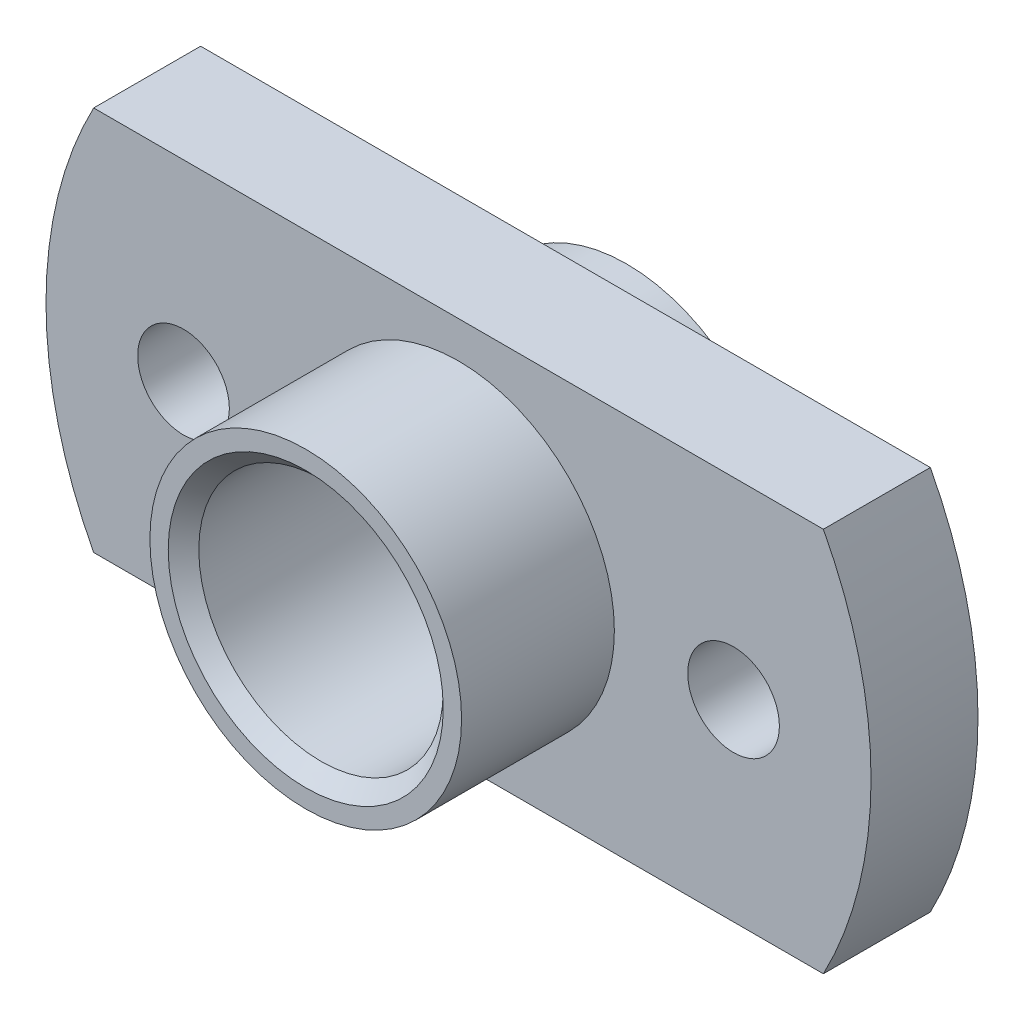
ISO-10303-21;
HEADER;
FILE_DESCRIPTION(('STEP AP214'),'2;1');
FILE_NAME('part.step','',(''),(''),'','','');
FILE_SCHEMA(('AUTOMOTIVE_DESIGN { 1 0 10303 214 1 1 1 1 }'));
ENDSEC;
DATA;
#1=APPLICATION_CONTEXT('core data for automotive mechanical design processes');
#2=APPLICATION_PROTOCOL_DEFINITION('international standard','automotive_design',2000,#1);
#3=PRODUCT_CONTEXT('',#1,'mechanical');
#4=PRODUCT('Part','Part','',(#3));
#5=PRODUCT_RELATED_PRODUCT_CATEGORY('part','',(#4));
#6=PRODUCT_DEFINITION_FORMATION('','',#4);
#7=PRODUCT_DEFINITION_CONTEXT('part definition',#1,'design');
#8=PRODUCT_DEFINITION('design','',#6,#7);
#9=PRODUCT_DEFINITION_SHAPE('','',#8);
#10=(LENGTH_UNIT() NAMED_UNIT(*) SI_UNIT(.MILLI.,.METRE.));
#11=(NAMED_UNIT(*) PLANE_ANGLE_UNIT() SI_UNIT($,.RADIAN.));
#12=(NAMED_UNIT(*) SI_UNIT($,.STERADIAN.) SOLID_ANGLE_UNIT());
#13=UNCERTAINTY_MEASURE_WITH_UNIT(LENGTH_MEASURE(1.E-05),#10,'distance_accuracy_value','');
#14=(GEOMETRIC_REPRESENTATION_CONTEXT(3) GLOBAL_UNCERTAINTY_ASSIGNED_CONTEXT((#13)) GLOBAL_UNIT_ASSIGNED_CONTEXT((#10,
#11,#12)) REPRESENTATION_CONTEXT('',''));
#15=CARTESIAN_POINT('',(0.,0.,0.));
#16=DIRECTION('',(0.,0.,1.));
#17=DIRECTION('',(1.,0.,0.));
#18=AXIS2_PLACEMENT_3D('',#15,#16,#17);
#19=CARTESIAN_POINT('',(0.,0.,3.5));
#20=DIRECTION('',(0.,0.,1.));
#21=DIRECTION('',(1.,0.,0.));
#22=AXIS2_PLACEMENT_3D('',#19,#20,#21);
#23=PLANE('',#22);
#24=CARTESIAN_POINT('',(0.,0.,3.5));
#25=DIRECTION('',(0.,0.,1.));
#26=DIRECTION('',(1.,0.,0.));
#27=AXIS2_PLACEMENT_3D('',#24,#25,#26);
#28=CIRCLE('',#27,5.1);
#29=CARTESIAN_POINT('',(5.1,0.,3.5));
#30=VERTEX_POINT('',#29);
#31=EDGE_CURVE('E118',#30,#30,#28,.T.);
#32=ORIENTED_EDGE('',*,*,#31,.F.);
#33=EDGE_LOOP('',(#32));
#34=FACE_BOUND('',#33,.T.);
#35=CARTESIAN_POINT('',(-9.,0.,3.5));
#36=DIRECTION('',(0.,0.,1.));
#37=DIRECTION('',(1.,0.,0.));
#38=AXIS2_PLACEMENT_3D('',#35,#36,#37);
#39=CIRCLE('',#38,1.5);
#40=CARTESIAN_POINT('',(-7.5,0.,3.5));
#41=VERTEX_POINT('',#40);
#42=EDGE_CURVE('E111',#41,#41,#39,.T.);
#43=ORIENTED_EDGE('',*,*,#42,.F.);
#44=EDGE_LOOP('',(#43));
#45=FACE_BOUND('',#44,.T.);
#46=CARTESIAN_POINT('',(0.,0.,3.5));
#47=DIRECTION('',(0.,0.,1.));
#48=DIRECTION('',(1.,0.,0.));
#49=AXIS2_PLACEMENT_3D('',#46,#47,#48);
#50=CIRCLE('',#49,13.5);
#51=CARTESIAN_POINT('',(-11.9398492452794,6.3,3.5));
#52=VERTEX_POINT('',#51);
#53=CARTESIAN_POINT('',(-11.9398492452794,-6.3,3.5));
#54=VERTEX_POINT('',#53);
#55=EDGE_CURVE('E93',#52,#54,#50,.T.);
#56=ORIENTED_EDGE('',*,*,#55,.T.);
#57=DIRECTION('',(1.,0.,0.));
#58=VECTOR('',#57,1.);
#59=CARTESIAN_POINT('',(-11.9398492452794,-6.3,3.5));
#60=LINE('',#59,#58);
#61=CARTESIAN_POINT('',(11.9398492452794,-6.3,3.5));
#62=VERTEX_POINT('',#61);
#63=EDGE_CURVE('E88',#54,#62,#60,.T.);
#64=ORIENTED_EDGE('',*,*,#63,.T.);
#65=CARTESIAN_POINT('',(0.,0.,3.5));
#66=DIRECTION('',(0.,0.,1.));
#67=DIRECTION('',(1.,0.,0.));
#68=AXIS2_PLACEMENT_3D('',#65,#66,#67);
#69=CIRCLE('',#68,13.5);
#70=CARTESIAN_POINT('',(11.9398492452794,6.3,3.5));
#71=VERTEX_POINT('',#70);
#72=EDGE_CURVE('E91',#62,#71,#69,.T.);
#73=ORIENTED_EDGE('',*,*,#72,.T.);
#74=DIRECTION('',(-1.,0.,0.));
#75=VECTOR('',#74,1.);
#76=CARTESIAN_POINT('',(-11.9398492452794,6.3,3.5));
#77=LINE('',#76,#75);
#78=EDGE_CURVE('E57',#71,#52,#77,.T.);
#79=ORIENTED_EDGE('',*,*,#78,.T.);
#80=EDGE_LOOP('',(#56,#64,#73,#79));
#81=FACE_BOUND('',#80,.T.);
#82=CARTESIAN_POINT('',(9.,0.,3.5));
#83=DIRECTION('',(0.,0.,1.));
#84=DIRECTION('',(1.,0.,0.));
#85=AXIS2_PLACEMENT_3D('',#82,#83,#84);
#86=CIRCLE('',#85,1.5);
#87=CARTESIAN_POINT('',(10.5,0.,3.5));
#88=VERTEX_POINT('',#87);
#89=EDGE_CURVE('E194',#88,#88,#86,.T.);
#90=ORIENTED_EDGE('',*,*,#89,.F.);
#91=EDGE_LOOP('',(#90));
#92=FACE_BOUND('',#91,.T.);
#93=ADVANCED_FACE('F39',(#34,#45,#81,#92),#23,.T.);
#94=CARTESIAN_POINT('',(0.,0.,0.));
#95=DIRECTION('',(0.,0.,1.));
#96=DIRECTION('',(1.,0.,0.));
#97=AXIS2_PLACEMENT_3D('',#94,#95,#96);
#98=PLANE('',#97);
#99=CARTESIAN_POINT('',(0.,0.,0.));
#100=DIRECTION('',(0.,0.,1.));
#101=DIRECTION('',(1.,0.,0.));
#102=AXIS2_PLACEMENT_3D('',#99,#100,#101);
#103=CIRCLE('',#102,5.1);
#104=CARTESIAN_POINT('',(5.1,0.,0.));
#105=VERTEX_POINT('',#104);
#106=EDGE_CURVE('E119',#105,#105,#103,.T.);
#107=ORIENTED_EDGE('',*,*,#106,.T.);
#108=EDGE_LOOP('',(#107));
#109=FACE_BOUND('',#108,.T.);
#110=CARTESIAN_POINT('',(0.,0.,0.));
#111=DIRECTION('',(0.,0.,1.));
#112=DIRECTION('',(1.,0.,0.));
#113=AXIS2_PLACEMENT_3D('',#110,#111,#112);
#114=CIRCLE('',#113,13.5);
#115=CARTESIAN_POINT('',(-11.9398492452794,6.3,0.));
#116=VERTEX_POINT('',#115);
#117=CARTESIAN_POINT('',(-11.9398492452794,-6.3,0.));
#118=VERTEX_POINT('',#117);
#119=EDGE_CURVE('E108',#116,#118,#114,.T.);
#120=ORIENTED_EDGE('',*,*,#119,.F.);
#121=DIRECTION('',(-1.,0.,0.));
#122=VECTOR('',#121,1.);
#123=CARTESIAN_POINT('',(-11.9398492452794,6.3,0.));
#124=LINE('',#123,#122);
#125=CARTESIAN_POINT('',(11.9398492452794,6.3,0.));
#126=VERTEX_POINT('',#125);
#127=EDGE_CURVE('E80',#126,#116,#124,.T.);
#128=ORIENTED_EDGE('',*,*,#127,.F.);
#129=CARTESIAN_POINT('',(0.,0.,0.));
#130=DIRECTION('',(0.,0.,1.));
#131=DIRECTION('',(1.,0.,0.));
#132=AXIS2_PLACEMENT_3D('',#129,#130,#131);
#133=CIRCLE('',#132,13.5);
#134=CARTESIAN_POINT('',(11.9398492452794,-6.3,0.));
#135=VERTEX_POINT('',#134);
#136=EDGE_CURVE('E74',#135,#126,#133,.T.);
#137=ORIENTED_EDGE('',*,*,#136,.F.);
#138=DIRECTION('',(1.,0.,0.));
#139=VECTOR('',#138,1.);
#140=CARTESIAN_POINT('',(-11.9398492452794,-6.3,0.));
#141=LINE('',#140,#139);
#142=EDGE_CURVE('E98',#118,#135,#141,.T.);
#143=ORIENTED_EDGE('',*,*,#142,.F.);
#144=EDGE_LOOP('',(#120,#128,#137,#143));
#145=FACE_BOUND('',#144,.T.);
#146=CARTESIAN_POINT('',(-9.,0.,0.));
#147=DIRECTION('',(0.,0.,1.));
#148=DIRECTION('',(1.,0.,0.));
#149=AXIS2_PLACEMENT_3D('',#146,#147,#148);
#150=CIRCLE('',#149,1.5);
#151=CARTESIAN_POINT('',(-7.5,0.,0.));
#152=VERTEX_POINT('',#151);
#153=EDGE_CURVE('E190',#152,#152,#150,.T.);
#154=ORIENTED_EDGE('',*,*,#153,.T.);
#155=EDGE_LOOP('',(#154));
#156=FACE_BOUND('',#155,.T.);
#157=CARTESIAN_POINT('',(9.,0.,0.));
#158=DIRECTION('',(0.,0.,1.));
#159=DIRECTION('',(1.,0.,0.));
#160=AXIS2_PLACEMENT_3D('',#157,#158,#159);
#161=CIRCLE('',#160,1.5);
#162=CARTESIAN_POINT('',(10.5,0.,0.));
#163=VERTEX_POINT('',#162);
#164=EDGE_CURVE('E122',#163,#163,#161,.T.);
#165=ORIENTED_EDGE('',*,*,#164,.T.);
#166=EDGE_LOOP('',(#165));
#167=FACE_BOUND('',#166,.T.);
#168=ADVANCED_FACE('F153',(#109,#145,#156,#167),#98,.F.);
#169=CARTESIAN_POINT('',(0.,0.,3.5));
#170=DIRECTION('',(0.,0.,-1.));
#171=DIRECTION('',(-1.,0.,0.));
#172=AXIS2_PLACEMENT_3D('',#169,#170,#171);
#173=CYLINDRICAL_SURFACE('',#172,13.5);
#174=ORIENTED_EDGE('',*,*,#119,.T.);
#175=DIRECTION('',(0.,0.,-1.));
#176=VECTOR('',#175,1.);
#177=CARTESIAN_POINT('',(-11.9398492452794,-6.3,3.5));
#178=LINE('',#177,#176);
#179=EDGE_CURVE('E99',#54,#118,#178,.T.);
#180=ORIENTED_EDGE('',*,*,#179,.F.);
#181=ORIENTED_EDGE('',*,*,#55,.F.);
#182=DIRECTION('',(0.,0.,-1.));
#183=VECTOR('',#182,1.);
#184=CARTESIAN_POINT('',(-11.9398492452794,6.3,3.5));
#185=LINE('',#184,#183);
#186=EDGE_CURVE('E104',#52,#116,#185,.T.);
#187=ORIENTED_EDGE('',*,*,#186,.T.);
#188=EDGE_LOOP('',(#174,#180,#181,#187));
#189=FACE_BOUND('',#188,.T.);
#190=ADVANCED_FACE('F159',(#189),#173,.T.);
#191=CARTESIAN_POINT('',(-11.9398492452794,-6.3,3.5));
#192=DIRECTION('',(0.,1.,0.));
#193=DIRECTION('',(0.,0.,1.));
#194=AXIS2_PLACEMENT_3D('',#191,#192,#193);
#195=PLANE('',#194);
#196=ORIENTED_EDGE('',*,*,#142,.T.);
#197=DIRECTION('',(0.,0.,-1.));
#198=VECTOR('',#197,1.);
#199=CARTESIAN_POINT('',(11.9398492452794,-6.3,3.5));
#200=LINE('',#199,#198);
#201=EDGE_CURVE('E96',#62,#135,#200,.T.);
#202=ORIENTED_EDGE('',*,*,#201,.F.);
#203=ORIENTED_EDGE('',*,*,#63,.F.);
#204=ORIENTED_EDGE('',*,*,#179,.T.);
#205=EDGE_LOOP('',(#196,#202,#203,#204));
#206=FACE_BOUND('',#205,.T.);
#207=ADVANCED_FACE('F97',(#206),#195,.F.);
#208=CARTESIAN_POINT('',(0.,0.,3.5));
#209=DIRECTION('',(0.,0.,-1.));
#210=DIRECTION('',(-1.,0.,0.));
#211=AXIS2_PLACEMENT_3D('',#208,#209,#210);
#212=CYLINDRICAL_SURFACE('',#211,13.5);
#213=ORIENTED_EDGE('',*,*,#136,.T.);
#214=DIRECTION('',(0.,0.,-1.));
#215=VECTOR('',#214,1.);
#216=CARTESIAN_POINT('',(11.9398492452794,6.3,3.5));
#217=LINE('',#216,#215);
#218=EDGE_CURVE('E100',#71,#126,#217,.T.);
#219=ORIENTED_EDGE('',*,*,#218,.F.);
#220=ORIENTED_EDGE('',*,*,#72,.F.);
#221=ORIENTED_EDGE('',*,*,#201,.T.);
#222=EDGE_LOOP('',(#213,#219,#220,#221));
#223=FACE_BOUND('',#222,.T.);
#224=ADVANCED_FACE('F102',(#223),#212,.T.);
#225=CARTESIAN_POINT('',(-11.9398492452794,6.3,3.5));
#226=DIRECTION('',(0.,-1.,0.));
#227=DIRECTION('',(0.,0.,-1.));
#228=AXIS2_PLACEMENT_3D('',#225,#226,#227);
#229=PLANE('',#228);
#230=ORIENTED_EDGE('',*,*,#127,.T.);
#231=ORIENTED_EDGE('',*,*,#186,.F.);
#232=ORIENTED_EDGE('',*,*,#78,.F.);
#233=ORIENTED_EDGE('',*,*,#218,.T.);
#234=EDGE_LOOP('',(#230,#231,#232,#233));
#235=FACE_BOUND('',#234,.T.);
#236=ADVANCED_FACE('F168',(#235),#229,.F.);
#237=CARTESIAN_POINT('',(-9.,0.,3.5));
#238=DIRECTION('',(0.,0.,-1.));
#239=DIRECTION('',(-1.,0.,0.));
#240=AXIS2_PLACEMENT_3D('',#237,#238,#239);
#241=CYLINDRICAL_SURFACE('',#240,1.5);
#242=ORIENTED_EDGE('',*,*,#42,.T.);
#243=EDGE_LOOP('',(#242));
#244=FACE_BOUND('',#243,.T.);
#245=ORIENTED_EDGE('',*,*,#153,.F.);
#246=EDGE_LOOP('',(#245));
#247=FACE_BOUND('',#246,.T.);
#248=ADVANCED_FACE('F165',(#244,#247),#241,.F.);
#249=CARTESIAN_POINT('',(9.,0.,3.5));
#250=DIRECTION('',(0.,0.,-1.));
#251=DIRECTION('',(-1.,0.,0.));
#252=AXIS2_PLACEMENT_3D('',#249,#250,#251);
#253=CYLINDRICAL_SURFACE('',#252,1.5);
#254=ORIENTED_EDGE('',*,*,#89,.T.);
#255=EDGE_LOOP('',(#254));
#256=FACE_BOUND('',#255,.T.);
#257=ORIENTED_EDGE('',*,*,#164,.F.);
#258=EDGE_LOOP('',(#257));
#259=FACE_BOUND('',#258,.T.);
#260=ADVANCED_FACE('F206',(#256,#259),#253,.F.);
#261=CARTESIAN_POINT('',(0.,0.,-2.));
#262=DIRECTION('',(0.,0.,1.));
#263=DIRECTION('',(1.,0.,0.));
#264=AXIS2_PLACEMENT_3D('',#261,#262,#263);
#265=PLANE('',#264);
#266=CARTESIAN_POINT('',(0.,0.,-2.));
#267=DIRECTION('',(0.,0.,1.));
#268=DIRECTION('',(1.,0.,0.));
#269=AXIS2_PLACEMENT_3D('',#266,#267,#268);
#270=CIRCLE('',#269,4.50000000000001);
#271=CARTESIAN_POINT('',(4.50000000000001,0.,-2.));
#272=VERTEX_POINT('',#271);
#273=EDGE_CURVE('E49',#272,#272,#270,.T.);
#274=ORIENTED_EDGE('',*,*,#273,.T.);
#275=EDGE_LOOP('',(#274));
#276=FACE_BOUND('',#275,.T.);
#277=CARTESIAN_POINT('',(0.,0.,-2.));
#278=DIRECTION('',(0.,0.,1.));
#279=DIRECTION('',(1.,0.,0.));
#280=AXIS2_PLACEMENT_3D('',#277,#278,#279);
#281=CIRCLE('',#280,5.1);
#282=CARTESIAN_POINT('',(5.1,0.,-2.));
#283=VERTEX_POINT('',#282);
#284=EDGE_CURVE('E123',#283,#283,#281,.T.);
#285=ORIENTED_EDGE('',*,*,#284,.F.);
#286=EDGE_LOOP('',(#285));
#287=FACE_BOUND('',#286,.T.);
#288=ADVANCED_FACE('F132',(#276,#287),#265,.F.);
#289=CARTESIAN_POINT('',(0.,0.,-2.));
#290=DIRECTION('',(0.,0.,1.));
#291=DIRECTION('',(1.,0.,0.));
#292=AXIS2_PLACEMENT_3D('',#289,#290,#291);
#293=CYLINDRICAL_SURFACE('',#292,5.1);
#294=ORIENTED_EDGE('',*,*,#284,.T.);
#295=EDGE_LOOP('',(#294));
#296=FACE_BOUND('',#295,.T.);
#297=ORIENTED_EDGE('',*,*,#106,.F.);
#298=EDGE_LOOP('',(#297));
#299=FACE_BOUND('',#298,.T.);
#300=ADVANCED_FACE('F214',(#296,#299),#293,.T.);
#301=ORIENTED_EDGE('',*,*,#31,.T.);
#302=EDGE_LOOP('',(#301));
#303=FACE_BOUND('',#302,.T.);
#304=CARTESIAN_POINT('',(0.,0.,8.5));
#305=DIRECTION('',(0.,0.,1.));
#306=DIRECTION('',(1.,0.,0.));
#307=AXIS2_PLACEMENT_3D('',#304,#305,#306);
#308=CIRCLE('',#307,5.1);
#309=CARTESIAN_POINT('',(5.1,0.,8.5));
#310=VERTEX_POINT('',#309);
#311=EDGE_CURVE('E228',#310,#310,#308,.T.);
#312=ORIENTED_EDGE('',*,*,#311,.F.);
#313=EDGE_LOOP('',(#312));
#314=FACE_BOUND('',#313,.T.);
#315=ADVANCED_FACE('F217',(#303,#314),#293,.T.);
#316=CARTESIAN_POINT('',(0.,0.,8.5));
#317=DIRECTION('',(0.,0.,1.));
#318=DIRECTION('',(1.,0.,0.));
#319=AXIS2_PLACEMENT_3D('',#316,#317,#318);
#320=PLANE('',#319);
#321=CARTESIAN_POINT('',(0.,0.,8.5));
#322=DIRECTION('',(0.,0.,1.));
#323=DIRECTION('',(1.,0.,0.));
#324=AXIS2_PLACEMENT_3D('',#321,#322,#323);
#325=CIRCLE('',#324,4.5);
#326=CARTESIAN_POINT('',(4.5,0.,8.5));
#327=VERTEX_POINT('',#326);
#328=EDGE_CURVE('E11',#327,#327,#325,.F.);
#329=ORIENTED_EDGE('',*,*,#328,.T.);
#330=EDGE_LOOP('',(#329));
#331=FACE_BOUND('',#330,.T.);
#332=ORIENTED_EDGE('',*,*,#311,.T.);
#333=EDGE_LOOP('',(#332));
#334=FACE_BOUND('',#333,.T.);
#335=ADVANCED_FACE('F143',(#331,#334),#320,.T.);
#336=CARTESIAN_POINT('',(0.,0.,-13.3137084989848));
#337=DIRECTION('',(0.,0.,1.));
#338=DIRECTION('',(1.,0.,0.));
#339=AXIS2_PLACEMENT_3D('',#336,#337,#338);
#340=CYLINDRICAL_SURFACE('',#339,4.);
#341=CARTESIAN_POINT('',(0.,0.,-1.5));
#342=DIRECTION('',(0.,0.,1.));
#343=DIRECTION('',(1.,0.,0.));
#344=AXIS2_PLACEMENT_3D('',#341,#342,#343);
#345=CIRCLE('',#344,4.);
#346=CARTESIAN_POINT('',(4.,0.,-1.5));
#347=VERTEX_POINT('',#346);
#348=EDGE_CURVE('E127',#347,#347,#345,.F.);
#349=ORIENTED_EDGE('',*,*,#348,.T.);
#350=EDGE_LOOP('',(#349));
#351=FACE_BOUND('',#350,.T.);
#352=CARTESIAN_POINT('',(0.,0.,8.00000000000001));
#353=DIRECTION('',(0.,0.,1.));
#354=DIRECTION('',(1.,0.,0.));
#355=AXIS2_PLACEMENT_3D('',#352,#353,#354);
#356=CIRCLE('',#355,4.);
#357=CARTESIAN_POINT('',(4.,0.,8.00000000000001));
#358=VERTEX_POINT('',#357);
#359=EDGE_CURVE('E124',#358,#358,#356,.T.);
#360=ORIENTED_EDGE('',*,*,#359,.T.);
#361=EDGE_LOOP('',(#360));
#362=FACE_BOUND('',#361,.T.);
#363=ADVANCED_FACE('F138',(#351,#362),#340,.F.);
#364=CARTESIAN_POINT('',(0.,0.,-1.5));
#365=DIRECTION('',(0.,0.,-1.));
#366=DIRECTION('',(-1.,0.,0.));
#367=AXIS2_PLACEMENT_3D('',#364,#365,#366);
#368=CONICAL_SURFACE('',#367,4.,0.785398163397452);
#369=ORIENTED_EDGE('',*,*,#273,.F.);
#370=EDGE_LOOP('',(#369));
#371=FACE_BOUND('',#370,.T.);
#372=ORIENTED_EDGE('',*,*,#348,.F.);
#373=EDGE_LOOP('',(#372));
#374=FACE_BOUND('',#373,.T.);
#375=ADVANCED_FACE('F135',(#371,#374),#368,.F.);
#376=CARTESIAN_POINT('',(0.,0.,8.00000000000001));
#377=DIRECTION('',(0.,0.,1.));
#378=DIRECTION('',(1.,0.,0.));
#379=AXIS2_PLACEMENT_3D('',#376,#377,#378);
#380=CONICAL_SURFACE('',#379,4.,0.785398163397452);
#381=ORIENTED_EDGE('',*,*,#328,.F.);
#382=EDGE_LOOP('',(#381));
#383=FACE_BOUND('',#382,.T.);
#384=ORIENTED_EDGE('',*,*,#359,.F.);
#385=EDGE_LOOP('',(#384));
#386=FACE_BOUND('',#385,.T.);
#387=ADVANCED_FACE('F42',(#383,#386),#380,.F.);
#388=CLOSED_SHELL('',(#93,#168,#190,#207,#224,#236,#248,#260,#288,#300,#315,#335,#363,#375,#387));
#389=MANIFOLD_SOLID_BREP('B2',#388);
#390=ADVANCED_BREP_SHAPE_REPRESENTATION('',(#18,#389),#14);
#391=SHAPE_DEFINITION_REPRESENTATION(#9,#390);
ENDSEC;
END-ISO-10303-21;
